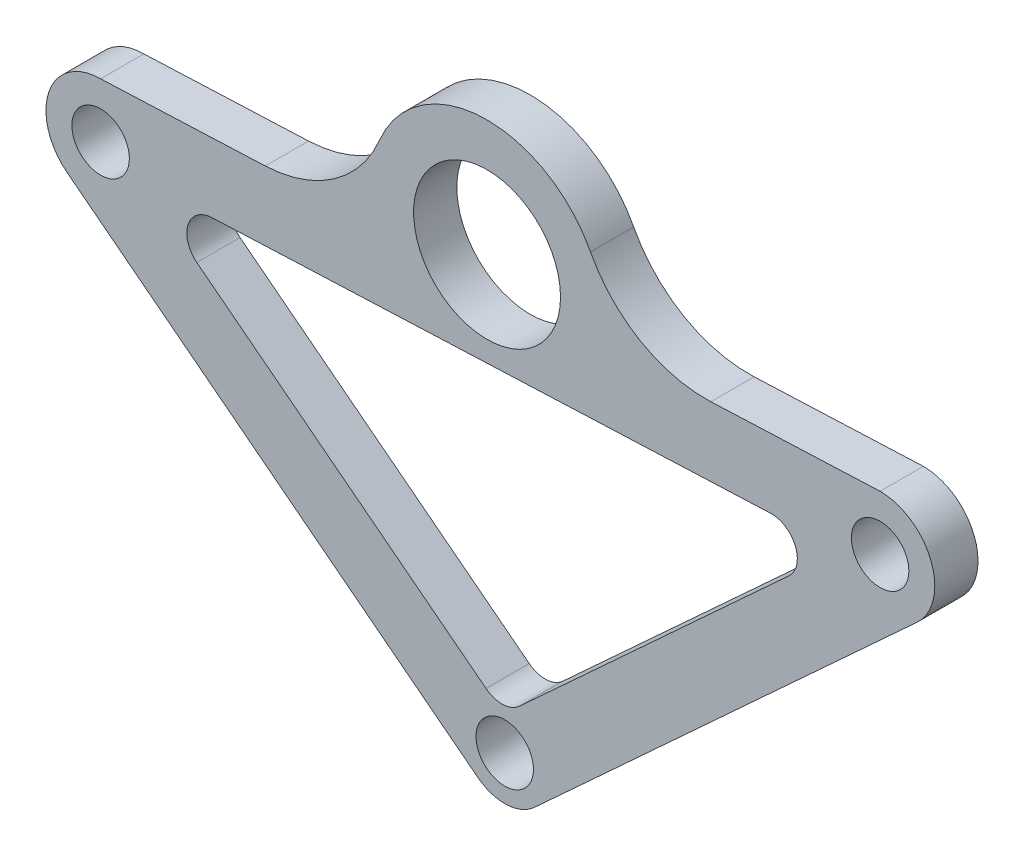
ISO-10303-21;
HEADER;
FILE_DESCRIPTION(('STEP AP214'),'2;1');
FILE_NAME('part.step','',(''),(''),'','','');
FILE_SCHEMA(('AUTOMOTIVE_DESIGN { 1 0 10303 214 1 1 1 1 }'));
ENDSEC;
DATA;
#1=APPLICATION_CONTEXT('core data for automotive mechanical design processes');
#2=APPLICATION_PROTOCOL_DEFINITION('international standard','automotive_design',2000,#1);
#3=PRODUCT_CONTEXT('',#1,'mechanical');
#4=PRODUCT('Part','Part','',(#3));
#5=PRODUCT_RELATED_PRODUCT_CATEGORY('part','',(#4));
#6=PRODUCT_DEFINITION_FORMATION('','',#4);
#7=PRODUCT_DEFINITION_CONTEXT('part definition',#1,'design');
#8=PRODUCT_DEFINITION('design','',#6,#7);
#9=PRODUCT_DEFINITION_SHAPE('','',#8);
#10=(LENGTH_UNIT() NAMED_UNIT(*) SI_UNIT(.MILLI.,.METRE.));
#11=(NAMED_UNIT(*) PLANE_ANGLE_UNIT() SI_UNIT($,.RADIAN.));
#12=(NAMED_UNIT(*) SI_UNIT($,.STERADIAN.) SOLID_ANGLE_UNIT());
#13=UNCERTAINTY_MEASURE_WITH_UNIT(LENGTH_MEASURE(1.E-05),#10,'distance_accuracy_value','');
#14=(GEOMETRIC_REPRESENTATION_CONTEXT(3) GLOBAL_UNCERTAINTY_ASSIGNED_CONTEXT((#13)) GLOBAL_UNIT_ASSIGNED_CONTEXT((#10,
#11,#12)) REPRESENTATION_CONTEXT('',''));
#15=CARTESIAN_POINT('',(0.,0.,0.));
#16=DIRECTION('',(0.,0.,1.));
#17=DIRECTION('',(1.,0.,0.));
#18=AXIS2_PLACEMENT_3D('',#15,#16,#17);
#19=CARTESIAN_POINT('',(-8.8542481683794,-11.4164608048564,2.5));
#20=DIRECTION('',(0.612852318232689,0.790197466483422,0.));
#21=DIRECTION('',(-0.790197466483422,0.612852318232689,0.));
#22=AXIS2_PLACEMENT_3D('',#19,#20,#21);
#23=PLANE('',#22);
#24=DIRECTION('',(0.790197466483422,-0.61285231823269,0.));
#25=VECTOR('',#24,1.);
#26=CARTESIAN_POINT('',(-8.8542481683794,-11.4164608048564,-2.5));
#27=LINE('',#26,#25);
#28=CARTESIAN_POINT('',(-21.5253821373528,-1.58912756613958,-2.5));
#29=VERTEX_POINT('',#28);
#30=CARTESIAN_POINT('',(11.9313136502869,-27.5370892384402,-2.5));
#31=VERTEX_POINT('',#30);
#32=EDGE_CURVE('E226',#29,#31,#27,.T.);
#33=ORIENTED_EDGE('',*,*,#32,.F.);
#34=DIRECTION('',(0.,0.,-1.));
#35=VECTOR('',#34,1.);
#36=CARTESIAN_POINT('',(-21.5253821373528,-1.58912756613958,2.5));
#37=LINE('',#36,#35);
#38=CARTESIAN_POINT('',(-21.5253821373528,-1.58912756613958,2.5));
#39=VERTEX_POINT('',#38);
#40=EDGE_CURVE('E11',#39,#29,#37,.T.);
#41=ORIENTED_EDGE('',*,*,#40,.F.);
#42=DIRECTION('',(0.790197466483422,-0.61285231823269,0.));
#43=VECTOR('',#42,1.);
#44=CARTESIAN_POINT('',(-8.8542481683794,-11.4164608048564,2.5));
#45=LINE('',#44,#43);
#46=CARTESIAN_POINT('',(11.9313136502869,-27.5370892384402,2.5));
#47=VERTEX_POINT('',#46);
#48=EDGE_CURVE('E347',#39,#47,#45,.T.);
#49=ORIENTED_EDGE('',*,*,#48,.T.);
#50=DIRECTION('',(0.,0.,-1.));
#51=VECTOR('',#50,1.);
#52=CARTESIAN_POINT('',(11.9313136502869,-27.5370892384402,2.5));
#53=LINE('',#52,#51);
#54=EDGE_CURVE('E61',#47,#31,#53,.T.);
#55=ORIENTED_EDGE('',*,*,#54,.T.);
#56=EDGE_LOOP('',(#33,#41,#49,#55));
#57=FACE_BOUND('',#56,.T.);
#58=ADVANCED_FACE('F42',(#57),#23,.T.);
#59=CARTESIAN_POINT('',(-19.6868251826548,0.781464833310679,2.5));
#60=DIRECTION('',(0.,0.,-1.));
#61=DIRECTION('',(-1.,0.,0.));
#62=AXIS2_PLACEMENT_3D('',#59,#60,#61);
#63=CYLINDRICAL_SURFACE('',#62,3.);
#64=CARTESIAN_POINT('',(-19.6868251826548,0.781464833310679,-2.5));
#65=DIRECTION('',(0.,0.,1.));
#66=DIRECTION('',(1.,0.,0.));
#67=AXIS2_PLACEMENT_3D('',#64,#65,#66);
#68=CIRCLE('',#67,3.);
#69=CARTESIAN_POINT('',(-19.8120511604004,3.77885010292446,-2.5));
#70=VERTEX_POINT('',#69);
#71=EDGE_CURVE('E228',#29,#70,#68,.F.);
#72=ORIENTED_EDGE('',*,*,#71,.T.);
#73=DIRECTION('',(0.,0.,-1.));
#74=VECTOR('',#73,1.);
#75=CARTESIAN_POINT('',(-19.8120511604004,3.77885010292446,2.5));
#76=LINE('',#75,#74);
#77=CARTESIAN_POINT('',(-19.8120511604004,3.77885010292446,2.5));
#78=VERTEX_POINT('',#77);
#79=EDGE_CURVE('E52',#78,#70,#76,.T.);
#80=ORIENTED_EDGE('',*,*,#79,.F.);
#81=CARTESIAN_POINT('',(-19.6868251826548,0.781464833310679,2.5));
#82=DIRECTION('',(0.,0.,1.));
#83=DIRECTION('',(1.,0.,0.));
#84=AXIS2_PLACEMENT_3D('',#81,#82,#83);
#85=CIRCLE('',#84,3.);
#86=EDGE_CURVE('E349',#39,#78,#85,.F.);
#87=ORIENTED_EDGE('',*,*,#86,.F.);
#88=ORIENTED_EDGE('',*,*,#40,.T.);
#89=EDGE_LOOP('',(#72,#80,#87,#88));
#90=FACE_BOUND('',#89,.T.);
#91=ADVANCED_FACE('F369',(#90),#63,.F.);
#92=CARTESIAN_POINT('',(-0.19211965126212,4.59853956074665,2.5));
#93=DIRECTION('',(0.0417419925818735,-0.999128423204592,0.));
#94=DIRECTION('',(0.999128423204592,0.0417419925818735,0.));
#95=AXIS2_PLACEMENT_3D('',#92,#93,#94);
#96=PLANE('',#95);
#97=DIRECTION('',(-0.999128423204592,-0.0417419925818735,0.));
#98=VECTOR('',#97,1.);
#99=CARTESIAN_POINT('',(-0.19211965126212,4.59853956074665,-2.5));
#100=LINE('',#99,#98);
#101=CARTESIAN_POINT('',(44.820399723161,6.47909085543628,-2.5));
#102=VERTEX_POINT('',#101);
#103=EDGE_CURVE('E231',#102,#70,#100,.T.);
#104=ORIENTED_EDGE('',*,*,#103,.F.);
#105=DIRECTION('',(0.,0.,-1.));
#106=VECTOR('',#105,1.);
#107=CARTESIAN_POINT('',(44.820399723161,6.47909085543628,2.5));
#108=LINE('',#107,#106);
#109=CARTESIAN_POINT('',(44.820399723161,6.47909085543628,2.5));
#110=VERTEX_POINT('',#109);
#111=EDGE_CURVE('E171',#110,#102,#108,.T.);
#112=ORIENTED_EDGE('',*,*,#111,.F.);
#113=DIRECTION('',(-0.999128423204592,-0.0417419925818735,0.));
#114=VECTOR('',#113,1.);
#115=CARTESIAN_POINT('',(-0.19211965126212,4.59853956074665,2.5));
#116=LINE('',#115,#114);
#117=EDGE_CURVE('E181',#110,#78,#116,.T.);
#118=ORIENTED_EDGE('',*,*,#117,.T.);
#119=ORIENTED_EDGE('',*,*,#79,.T.);
#120=EDGE_LOOP('',(#104,#112,#118,#119));
#121=FACE_BOUND('',#120,.T.);
#122=ADVANCED_FACE('F352',(#121),#96,.T.);
#123=CARTESIAN_POINT('',(44.9456257009067,3.4817055858225,2.5));
#124=DIRECTION('',(0.,0.,-1.));
#125=DIRECTION('',(-1.,0.,0.));
#126=AXIS2_PLACEMENT_3D('',#123,#124,#125);
#127=CYLINDRICAL_SURFACE('',#126,3.);
#128=CARTESIAN_POINT('',(44.9456257009067,3.4817055858225,-2.5));
#129=DIRECTION('',(0.,0.,1.));
#130=DIRECTION('',(1.,0.,0.));
#131=AXIS2_PLACEMENT_3D('',#128,#129,#130);
#132=CIRCLE('',#131,3.);
#133=CARTESIAN_POINT('',(46.9755096845863,1.27273048120931,-2.5));
#134=VERTEX_POINT('',#133);
#135=EDGE_CURVE('E167',#134,#102,#132,.T.);
#136=ORIENTED_EDGE('',*,*,#135,.F.);
#137=DIRECTION('',(0.,0.,-1.));
#138=VECTOR('',#137,1.);
#139=CARTESIAN_POINT('',(46.9755096845863,1.27273048120931,2.5));
#140=LINE('',#139,#138);
#141=CARTESIAN_POINT('',(46.9755096845863,1.27273048120931,2.5));
#142=VERTEX_POINT('',#141);
#143=EDGE_CURVE('E162',#142,#134,#140,.T.);
#144=ORIENTED_EDGE('',*,*,#143,.F.);
#145=CARTESIAN_POINT('',(44.9456257009067,3.4817055858225,2.5));
#146=DIRECTION('',(0.,0.,1.));
#147=DIRECTION('',(1.,0.,0.));
#148=AXIS2_PLACEMENT_3D('',#145,#146,#147);
#149=CIRCLE('',#148,3.);
#150=EDGE_CURVE('E165',#142,#110,#149,.T.);
#151=ORIENTED_EDGE('',*,*,#150,.T.);
#152=ORIENTED_EDGE('',*,*,#111,.T.);
#153=EDGE_LOOP('',(#136,#144,#151,#152));
#154=FACE_BOUND('',#153,.T.);
#155=ADVANCED_FACE('F164',(#154),#127,.F.);
#156=CARTESIAN_POINT('',(20.872486130044,-22.7140085853932,2.5));
#157=DIRECTION('',(-0.676627994559879,0.736325034871066,0.));
#158=DIRECTION('',(-0.736325034871066,-0.676627994559879,0.));
#159=AXIS2_PLACEMENT_3D('',#156,#157,#158);
#160=PLANE('',#159);
#161=DIRECTION('',(0.736325034871066,0.676627994559879,0.));
#162=VECTOR('',#161,1.);
#163=CARTESIAN_POINT('',(20.872486130044,-22.7140085853932,-2.5));
#164=LINE('',#163,#162);
#165=CARTESIAN_POINT('',(15.7997545886646,-27.3754719436031,-2.5));
#166=VERTEX_POINT('',#165);
#167=EDGE_CURVE('E235',#166,#134,#164,.T.);
#168=ORIENTED_EDGE('',*,*,#167,.F.);
#169=DIRECTION('',(0.,0.,-1.));
#170=VECTOR('',#169,1.);
#171=CARTESIAN_POINT('',(15.7997545886646,-27.3754719436031,2.5));
#172=LINE('',#171,#170);
#173=CARTESIAN_POINT('',(15.7997545886646,-27.3754719436031,2.5));
#174=VERTEX_POINT('',#173);
#175=EDGE_CURVE('E110',#174,#166,#172,.T.);
#176=ORIENTED_EDGE('',*,*,#175,.F.);
#177=DIRECTION('',(0.736325034871066,0.676627994559879,0.));
#178=VECTOR('',#177,1.);
#179=CARTESIAN_POINT('',(20.872486130044,-22.7140085853932,2.5));
#180=LINE('',#179,#178);
#181=EDGE_CURVE('E179',#174,#142,#180,.T.);
#182=ORIENTED_EDGE('',*,*,#181,.T.);
#183=ORIENTED_EDGE('',*,*,#143,.T.);
#184=EDGE_LOOP('',(#168,#176,#182,#183));
#185=FACE_BOUND('',#184,.T.);
#186=ADVANCED_FACE('F183',(#185),#160,.T.);
#187=CARTESIAN_POINT('',(37.3163550542018,29.1856475864808,2.5));
#188=DIRECTION('',(0.,0.,-1.));
#189=DIRECTION('',(-1.,0.,0.));
#190=AXIS2_PLACEMENT_3D('',#187,#188,#189);
#191=CYLINDRICAL_SURFACE('',#190,15.);
#192=CARTESIAN_POINT('',(37.3163550542018,29.1856475864808,-2.5));
#193=DIRECTION('',(0.,0.,1.));
#194=DIRECTION('',(1.,0.,0.));
#195=AXIS2_PLACEMENT_3D('',#192,#193,#194);
#196=CIRCLE('',#195,15.);
#197=CARTESIAN_POINT('',(24.0182734467296,22.2458330672727,-2.5));
#198=VERTEX_POINT('',#197);
#199=CARTESIAN_POINT('',(37.9424849429299,14.1987212384119,-2.5));
#200=VERTEX_POINT('',#199);
#201=EDGE_CURVE('E190',#198,#200,#196,.T.);
#202=ORIENTED_EDGE('',*,*,#201,.F.);
#203=DIRECTION('',(0.,0.,-1.));
#204=VECTOR('',#203,1.);
#205=CARTESIAN_POINT('',(24.0182734467296,22.2458330672727,2.5));
#206=LINE('',#205,#204);
#207=CARTESIAN_POINT('',(24.0182734467296,22.2458330672727,2.5));
#208=VERTEX_POINT('',#207);
#209=EDGE_CURVE('E46',#208,#198,#206,.T.);
#210=ORIENTED_EDGE('',*,*,#209,.F.);
#211=CARTESIAN_POINT('',(37.3163550542018,29.1856475864808,2.5));
#212=DIRECTION('',(0.,0.,1.));
#213=DIRECTION('',(1.,0.,0.));
#214=AXIS2_PLACEMENT_3D('',#211,#212,#213);
#215=CIRCLE('',#214,15.);
#216=CARTESIAN_POINT('',(37.9424849429299,14.1987212384119,2.5));
#217=VERTEX_POINT('',#216);
#218=EDGE_CURVE('E240',#208,#217,#215,.T.);
#219=ORIENTED_EDGE('',*,*,#218,.T.);
#220=DIRECTION('',(0.,0.,-1.));
#221=VECTOR('',#220,1.);
#222=CARTESIAN_POINT('',(37.9424849429299,14.1987212384119,2.5));
#223=LINE('',#222,#221);
#224=EDGE_CURVE('E186',#217,#200,#223,.T.);
#225=ORIENTED_EDGE('',*,*,#224,.T.);
#226=EDGE_LOOP('',(#202,#210,#219,#225));
#227=FACE_BOUND('',#226,.T.);
#228=ADVANCED_FACE('F44',(#227),#191,.F.);
#229=CARTESIAN_POINT('',(12.0500000000046,15.9999999999855,2.5));
#230=DIRECTION('',(0.,0.,-1.));
#231=DIRECTION('',(-1.,0.,0.));
#232=AXIS2_PLACEMENT_3D('',#229,#230,#231);
#233=CYLINDRICAL_SURFACE('',#232,13.5000000000001);
#234=CARTESIAN_POINT('',(12.0500000000046,15.9999999999855,-2.5));
#235=DIRECTION('',(0.,0.,1.));
#236=DIRECTION('',(1.,0.,0.));
#237=AXIS2_PLACEMENT_3D('',#234,#235,#236);
#238=CIRCLE('',#237,13.5000000000001);
#239=CARTESIAN_POINT('',(-0.397539123776427,21.2257793449198,-2.5));
#240=VERTEX_POINT('',#239);
#241=EDGE_CURVE('E193',#198,#240,#238,.T.);
#242=ORIENTED_EDGE('',*,*,#241,.T.);
#243=DIRECTION('',(0.,0.,-1.));
#244=VECTOR('',#243,1.);
#245=CARTESIAN_POINT('',(-0.397539123776427,21.2257793449198,2.5));
#246=LINE('',#245,#244);
#247=CARTESIAN_POINT('',(-0.397539123776427,21.2257793449198,2.5));
#248=VERTEX_POINT('',#247);
#249=EDGE_CURVE('E265',#248,#240,#246,.T.);
#250=ORIENTED_EDGE('',*,*,#249,.F.);
#251=CARTESIAN_POINT('',(12.0500000000046,15.9999999999855,2.5));
#252=DIRECTION('',(0.,0.,1.));
#253=DIRECTION('',(1.,0.,0.));
#254=AXIS2_PLACEMENT_3D('',#251,#252,#253);
#255=CIRCLE('',#254,13.5000000000001);
#256=EDGE_CURVE('E273',#208,#248,#255,.T.);
#257=ORIENTED_EDGE('',*,*,#256,.F.);
#258=ORIENTED_EDGE('',*,*,#209,.T.);
#259=EDGE_LOOP('',(#242,#250,#257,#258));
#260=FACE_BOUND('',#259,.T.);
#261=ADVANCED_FACE('F272',(#260),#233,.T.);
#262=CARTESIAN_POINT('',(-14.2281381501997,27.0322008392913,2.5));
#263=DIRECTION('',(0.,0.,-1.));
#264=DIRECTION('',(-1.,0.,0.));
#265=AXIS2_PLACEMENT_3D('',#262,#263,#264);
#266=CYLINDRICAL_SURFACE('',#265,15.);
#267=CARTESIAN_POINT('',(-14.2281381501997,27.0322008392913,-2.5));
#268=DIRECTION('',(0.,0.,1.));
#269=DIRECTION('',(1.,0.,0.));
#270=AXIS2_PLACEMENT_3D('',#267,#268,#269);
#271=CIRCLE('',#270,15.);
#272=CARTESIAN_POINT('',(-13.6020082614716,12.0452744912224,-2.5));
#273=VERTEX_POINT('',#272);
#274=EDGE_CURVE('E196',#273,#240,#271,.T.);
#275=ORIENTED_EDGE('',*,*,#274,.F.);
#276=DIRECTION('',(0.,0.,-1.));
#277=VECTOR('',#276,1.);
#278=CARTESIAN_POINT('',(-13.6020082614716,12.0452744912224,2.5));
#279=LINE('',#278,#277);
#280=CARTESIAN_POINT('',(-13.6020082614716,12.0452744912224,2.5));
#281=VERTEX_POINT('',#280);
#282=EDGE_CURVE('E264',#281,#273,#279,.T.);
#283=ORIENTED_EDGE('',*,*,#282,.F.);
#284=CARTESIAN_POINT('',(-14.2281381501997,27.0322008392913,2.5));
#285=DIRECTION('',(0.,0.,1.));
#286=DIRECTION('',(1.,0.,0.));
#287=AXIS2_PLACEMENT_3D('',#284,#285,#286);
#288=CIRCLE('',#287,15.);
#289=EDGE_CURVE('E321',#281,#248,#288,.T.);
#290=ORIENTED_EDGE('',*,*,#289,.T.);
#291=ORIENTED_EDGE('',*,*,#249,.T.);
#292=EDGE_LOOP('',(#275,#283,#290,#291));
#293=FACE_BOUND('',#292,.T.);
#294=ADVANCED_FACE('F320',(#293),#266,.F.);
#295=CARTESIAN_POINT('',(-0.526055591917078,12.5915669463833,2.5));
#296=DIRECTION('',(0.0417419925818713,-0.999128423204592,0.));
#297=DIRECTION('',(0.999128423204592,0.0417419925818713,0.));
#298=AXIS2_PLACEMENT_3D('',#295,#296,#297);
#299=PLANE('',#298);
#300=DIRECTION('',(-0.999128423204592,-0.0417419925818713,0.));
#301=VECTOR('',#300,1.);
#302=CARTESIAN_POINT('',(-0.526055591917078,12.5915669463833,-2.5));
#303=LINE('',#302,#301);
#304=CARTESIAN_POINT('',(-32.6566394074545,11.2492023812981,-2.5));
#305=VERTEX_POINT('',#304);
#306=EDGE_CURVE('E199',#273,#305,#303,.T.);
#307=ORIENTED_EDGE('',*,*,#306,.T.);
#308=DIRECTION('',(0.,0.,-1.));
#309=VECTOR('',#308,1.);
#310=CARTESIAN_POINT('',(-32.6566394074545,11.2492023812981,2.5));
#311=LINE('',#310,#309);
#312=CARTESIAN_POINT('',(-32.6566394074545,11.2492023812981,2.5));
#313=VERTEX_POINT('',#312);
#314=EDGE_CURVE('E261',#313,#305,#311,.T.);
#315=ORIENTED_EDGE('',*,*,#314,.F.);
#316=DIRECTION('',(-0.999128423204592,-0.0417419925818713,0.));
#317=VECTOR('',#316,1.);
#318=CARTESIAN_POINT('',(-0.526055591917078,12.5915669463833,2.5));
#319=LINE('',#318,#317);
#320=EDGE_CURVE('E318',#281,#313,#319,.T.);
#321=ORIENTED_EDGE('',*,*,#320,.F.);
#322=ORIENTED_EDGE('',*,*,#282,.T.);
#323=EDGE_LOOP('',(#307,#315,#321,#322));
#324=FACE_BOUND('',#323,.T.);
#325=ADVANCED_FACE('F317',(#324),#299,.F.);
#326=CARTESIAN_POINT('',(-32.6566394074544,4.92420238127972,2.5));
#327=DIRECTION('',(0.,0.,-1.));
#328=DIRECTION('',(-1.,0.,0.));
#329=AXIS2_PLACEMENT_3D('',#326,#327,#328);
#330=CYLINDRICAL_SURFACE('',#329,6.32500000000671);
#331=CARTESIAN_POINT('',(-32.6566394074544,4.92420238127972,-2.5));
#332=DIRECTION('',(0.,0.,1.));
#333=DIRECTION('',(1.,0.,0.));
#334=AXIS2_PLACEMENT_3D('',#331,#332,#333);
#335=CIRCLE('',#334,6.32500000000671);
#336=CARTESIAN_POINT('',(-36.5329303202918,-0.0737965942095922,-2.5));
#337=VERTEX_POINT('',#336);
#338=EDGE_CURVE('E201',#305,#337,#335,.T.);
#339=ORIENTED_EDGE('',*,*,#338,.T.);
#340=DIRECTION('',(0.,0.,-1.));
#341=VECTOR('',#340,1.);
#342=CARTESIAN_POINT('',(-36.5329303202918,-0.0737965942095922,2.5));
#343=LINE('',#342,#341);
#344=CARTESIAN_POINT('',(-36.5329303202918,-0.0737965942095922,2.5));
#345=VERTEX_POINT('',#344);
#346=EDGE_CURVE('E258',#345,#337,#343,.T.);
#347=ORIENTED_EDGE('',*,*,#346,.F.);
#348=CARTESIAN_POINT('',(-32.6566394074544,4.92420238127972,2.5));
#349=DIRECTION('',(0.,0.,1.));
#350=DIRECTION('',(1.,0.,0.));
#351=AXIS2_PLACEMENT_3D('',#348,#349,#350);
#352=CIRCLE('',#351,6.32500000000671);
#353=EDGE_CURVE('E313',#313,#345,#352,.T.);
#354=ORIENTED_EDGE('',*,*,#353,.F.);
#355=ORIENTED_EDGE('',*,*,#314,.T.);
#356=EDGE_LOOP('',(#339,#347,#354,#355));
#357=FACE_BOUND('',#356,.T.);
#358=ADVANCED_FACE('F312',(#357),#330,.T.);
#359=CARTESIAN_POINT('',(-13.7570667142409,-17.7380405367238,2.5));
#360=DIRECTION('',(0.612852318232689,0.790197466483422,0.));
#361=DIRECTION('',(-0.790197466483422,0.612852318232689,0.));
#362=AXIS2_PLACEMENT_3D('',#359,#360,#361);
#363=PLANE('',#362);
#364=DIRECTION('',(0.790197466483422,-0.612852318232689,0.));
#365=VECTOR('',#364,1.);
#366=CARTESIAN_POINT('',(-13.7570667142409,-17.7380405367238,-2.5));
#367=LINE('',#366,#365);
#368=CARTESIAN_POINT('',(10.9800575124747,-36.923376572056,-2.5));
#369=VERTEX_POINT('',#368);
#370=EDGE_CURVE('E203',#337,#369,#367,.T.);
#371=ORIENTED_EDGE('',*,*,#370,.T.);
#372=DIRECTION('',(0.,0.,-1.));
#373=VECTOR('',#372,1.);
#374=CARTESIAN_POINT('',(10.9800575124747,-36.923376572056,2.5));
#375=LINE('',#374,#373);
#376=CARTESIAN_POINT('',(10.9800575124747,-36.923376572056,2.5));
#377=VERTEX_POINT('',#376);
#378=EDGE_CURVE('E255',#377,#369,#375,.T.);
#379=ORIENTED_EDGE('',*,*,#378,.F.);
#380=DIRECTION('',(0.790197466483422,-0.612852318232689,0.));
#381=VECTOR('',#380,1.);
#382=CARTESIAN_POINT('',(-13.7570667142409,-17.7380405367238,2.5));
#383=LINE('',#382,#381);
#384=EDGE_CURVE('E309',#345,#377,#383,.T.);
#385=ORIENTED_EDGE('',*,*,#384,.F.);
#386=ORIENTED_EDGE('',*,*,#346,.T.);
#387=EDGE_LOOP('',(#371,#379,#385,#386));
#388=FACE_BOUND('',#387,.T.);
#389=ADVANCED_FACE('F306',(#388),#363,.F.);
#390=CARTESIAN_POINT('',(14.0933472890967,-32.9091734423203,2.5));
#391=DIRECTION('',(0.,0.,-1.));
#392=DIRECTION('',(-1.,0.,0.));
#393=AXIS2_PLACEMENT_3D('',#390,#391,#392);
#394=CYLINDRICAL_SURFACE('',#393,5.08000000000001);
#395=CARTESIAN_POINT('',(14.0933472890967,-32.9091734423203,-2.5));
#396=DIRECTION('',(0.,0.,1.));
#397=DIRECTION('',(1.,0.,0.));
#398=AXIS2_PLACEMENT_3D('',#395,#396,#397);
#399=CIRCLE('',#398,5.08000000000001);
#400=CARTESIAN_POINT('',(17.5306175014609,-36.6497046194653,-2.5));
#401=VERTEX_POINT('',#400);
#402=EDGE_CURVE('E205',#369,#401,#399,.T.);
#403=ORIENTED_EDGE('',*,*,#402,.T.);
#404=DIRECTION('',(0.,0.,-1.));
#405=VECTOR('',#404,1.);
#406=CARTESIAN_POINT('',(17.5306175014609,-36.6497046194653,2.5));
#407=LINE('',#406,#405);
#408=CARTESIAN_POINT('',(17.5306175014609,-36.6497046194653,2.5));
#409=VERTEX_POINT('',#408);
#410=EDGE_CURVE('E252',#409,#401,#407,.T.);
#411=ORIENTED_EDGE('',*,*,#410,.F.);
#412=CARTESIAN_POINT('',(14.0933472890967,-32.9091734423203,2.5));
#413=DIRECTION('',(0.,0.,1.));
#414=DIRECTION('',(1.,0.,0.));
#415=AXIS2_PLACEMENT_3D('',#412,#413,#414);
#416=CIRCLE('',#415,5.08000000000001);
#417=EDGE_CURVE('E301',#377,#409,#416,.T.);
#418=ORIENTED_EDGE('',*,*,#417,.F.);
#419=ORIENTED_EDGE('',*,*,#378,.T.);
#420=EDGE_LOOP('',(#403,#411,#418,#419));
#421=FACE_BOUND('',#420,.T.);
#422=ADVANCED_FACE('F300',(#421),#394,.T.);
#423=CARTESIAN_POINT('',(26.285510086523,-28.6046088643617,2.5));
#424=DIRECTION('',(-0.676627994559879,0.736325034871066,0.));
#425=DIRECTION('',(-0.736325034871066,-0.676627994559879,0.));
#426=AXIS2_PLACEMENT_3D('',#423,#424,#425);
#427=PLANE('',#426);
#428=DIRECTION('',(0.736325034871066,0.676627994559879,0.));
#429=VECTOR('',#428,1.);
#430=CARTESIAN_POINT('',(26.285510086523,-28.6046088643617,-2.5));
#431=LINE('',#430,#429);
#432=CARTESIAN_POINT('',(61.8043641365677,4.0345787861778,-2.5));
#433=VERTEX_POINT('',#432);
#434=EDGE_CURVE('E207',#401,#433,#431,.T.);
#435=ORIENTED_EDGE('',*,*,#434,.T.);
#436=DIRECTION('',(0.,0.,-1.));
#437=VECTOR('',#436,1.);
#438=CARTESIAN_POINT('',(61.8043641365677,4.0345787861778,2.5));
#439=LINE('',#438,#437);
#440=CARTESIAN_POINT('',(61.8043641365677,4.0345787861778,2.5));
#441=VERTEX_POINT('',#440);
#442=EDGE_CURVE('E249',#441,#433,#439,.T.);
#443=ORIENTED_EDGE('',*,*,#442,.F.);
#444=DIRECTION('',(0.736325034871066,0.676627994559879,0.));
#445=VECTOR('',#444,1.);
#446=CARTESIAN_POINT('',(26.285510086523,-28.6046088643617,2.5));
#447=LINE('',#446,#445);
#448=EDGE_CURVE('E296',#409,#441,#447,.T.);
#449=ORIENTED_EDGE('',*,*,#448,.F.);
#450=ORIENTED_EDGE('',*,*,#410,.T.);
#451=EDGE_LOOP('',(#435,#443,#449,#450));
#452=FACE_BOUND('',#451,.T.);
#453=ADVANCED_FACE('F295',(#452),#427,.F.);
#454=CARTESIAN_POINT('',(57.5246920709766,8.69183463173721,2.5));
#455=DIRECTION('',(0.,0.,-1.));
#456=DIRECTION('',(-1.,0.,0.));
#457=AXIS2_PLACEMENT_3D('',#454,#455,#456);
#458=CYLINDRICAL_SURFACE('',#457,6.3249999999999);
#459=CARTESIAN_POINT('',(57.5246920709766,8.69183463173721,-2.5));
#460=DIRECTION('',(0.,0.,1.));
#461=DIRECTION('',(1.,0.,0.));
#462=AXIS2_PLACEMENT_3D('',#459,#460,#461);
#463=CIRCLE('',#462,6.3249999999999);
#464=CARTESIAN_POINT('',(57.5246920709766,15.0168346317371,-2.5));
#465=VERTEX_POINT('',#464);
#466=EDGE_CURVE('E209',#433,#465,#463,.T.);
#467=ORIENTED_EDGE('',*,*,#466,.T.);
#468=DIRECTION('',(0.,0.,-1.));
#469=VECTOR('',#468,1.);
#470=CARTESIAN_POINT('',(57.5246920709766,15.0168346317371,2.5));
#471=LINE('',#470,#469);
#472=CARTESIAN_POINT('',(57.5246920709766,15.0168346317371,2.5));
#473=VERTEX_POINT('',#472);
#474=EDGE_CURVE('E246',#473,#465,#471,.T.);
#475=ORIENTED_EDGE('',*,*,#474,.F.);
#476=CARTESIAN_POINT('',(57.5246920709766,8.69183463173721,2.5));
#477=DIRECTION('',(0.,0.,1.));
#478=DIRECTION('',(1.,0.,0.));
#479=AXIS2_PLACEMENT_3D('',#476,#477,#478);
#480=CIRCLE('',#479,6.3249999999999);
#481=EDGE_CURVE('E292',#441,#473,#480,.T.);
#482=ORIENTED_EDGE('',*,*,#481,.F.);
#483=ORIENTED_EDGE('',*,*,#442,.T.);
#484=EDGE_LOOP('',(#467,#475,#482,#483));
#485=FACE_BOUND('',#484,.T.);
#486=ADVANCED_FACE('F289',(#485),#458,.T.);
#487=CARTESIAN_POINT('',(-32.6566394074544,4.92420238127972,2.5));
#488=DIRECTION('',(0.,0.,-1.));
#489=DIRECTION('',(-1.,0.,0.));
#490=AXIS2_PLACEMENT_3D('',#487,#488,#489);
#491=CYLINDRICAL_SURFACE('',#490,3.32499999999999);
#492=CARTESIAN_POINT('',(-32.6566394074544,4.92420238127972,2.5));
#493=DIRECTION('',(0.,0.,1.));
#494=DIRECTION('',(1.,0.,0.));
#495=AXIS2_PLACEMENT_3D('',#492,#493,#494);
#496=CIRCLE('',#495,3.32499999999999);
#497=CARTESIAN_POINT('',(-29.3316394074545,4.92420238127972,2.5));
#498=VERTEX_POINT('',#497);
#499=EDGE_CURVE('E344',#498,#498,#496,.T.);
#500=ORIENTED_EDGE('',*,*,#499,.T.);
#501=EDGE_LOOP('',(#500));
#502=FACE_BOUND('',#501,.T.);
#503=CARTESIAN_POINT('',(-32.6566394074544,4.92420238127972,-2.5));
#504=DIRECTION('',(0.,0.,1.));
#505=DIRECTION('',(1.,0.,0.));
#506=AXIS2_PLACEMENT_3D('',#503,#504,#505);
#507=CIRCLE('',#506,3.32499999999999);
#508=CARTESIAN_POINT('',(-29.3316394074545,4.92420238127972,-2.5));
#509=VERTEX_POINT('',#508);
#510=EDGE_CURVE('E223',#509,#509,#507,.T.);
#511=ORIENTED_EDGE('',*,*,#510,.F.);
#512=EDGE_LOOP('',(#511));
#513=FACE_BOUND('',#512,.T.);
#514=ADVANCED_FACE('F378',(#502,#513),#491,.F.);
#515=CARTESIAN_POINT('',(14.0933472890967,-32.9091734423203,2.5));
#516=DIRECTION('',(0.,0.,-1.));
#517=DIRECTION('',(-1.,0.,0.));
#518=AXIS2_PLACEMENT_3D('',#515,#516,#517);
#519=CYLINDRICAL_SURFACE('',#518,3.325);
#520=CARTESIAN_POINT('',(14.0933472890967,-32.9091734423203,2.5));
#521=DIRECTION('',(0.,0.,1.));
#522=DIRECTION('',(1.,0.,0.));
#523=AXIS2_PLACEMENT_3D('',#520,#521,#522);
#524=CIRCLE('',#523,3.325);
#525=CARTESIAN_POINT('',(17.4183472890967,-32.9091734423203,2.5));
#526=VERTEX_POINT('',#525);
#527=EDGE_CURVE('E341',#526,#526,#524,.T.);
#528=ORIENTED_EDGE('',*,*,#527,.T.);
#529=EDGE_LOOP('',(#528));
#530=FACE_BOUND('',#529,.T.);
#531=CARTESIAN_POINT('',(14.0933472890967,-32.9091734423203,-2.5));
#532=DIRECTION('',(0.,0.,1.));
#533=DIRECTION('',(1.,0.,0.));
#534=AXIS2_PLACEMENT_3D('',#531,#532,#533);
#535=CIRCLE('',#534,3.325);
#536=CARTESIAN_POINT('',(17.4183472890967,-32.9091734423203,-2.5));
#537=VERTEX_POINT('',#536);
#538=EDGE_CURVE('E220',#537,#537,#535,.T.);
#539=ORIENTED_EDGE('',*,*,#538,.F.);
#540=EDGE_LOOP('',(#539));
#541=FACE_BOUND('',#540,.T.);
#542=ADVANCED_FACE('F381',(#530,#541),#519,.F.);
#543=CARTESIAN_POINT('',(57.5246920709766,8.69183463173721,2.5));
#544=DIRECTION('',(0.,0.,-1.));
#545=DIRECTION('',(-1.,0.,0.));
#546=AXIS2_PLACEMENT_3D('',#543,#544,#545);
#547=CYLINDRICAL_SURFACE('',#546,3.325);
#548=CARTESIAN_POINT('',(57.5246920709766,8.69183463173721,2.5));
#549=DIRECTION('',(0.,0.,1.));
#550=DIRECTION('',(1.,0.,0.));
#551=AXIS2_PLACEMENT_3D('',#548,#549,#550);
#552=CIRCLE('',#551,3.325);
#553=CARTESIAN_POINT('',(60.8496920709766,8.69183463173721,2.5));
#554=VERTEX_POINT('',#553);
#555=EDGE_CURVE('E338',#554,#554,#552,.T.);
#556=ORIENTED_EDGE('',*,*,#555,.T.);
#557=EDGE_LOOP('',(#556));
#558=FACE_BOUND('',#557,.T.);
#559=CARTESIAN_POINT('',(57.5246920709766,8.69183463173721,-2.5));
#560=DIRECTION('',(0.,0.,1.));
#561=DIRECTION('',(1.,0.,0.));
#562=AXIS2_PLACEMENT_3D('',#559,#560,#561);
#563=CIRCLE('',#562,3.325);
#564=CARTESIAN_POINT('',(60.8496920709766,8.69183463173721,-2.5));
#565=VERTEX_POINT('',#564);
#566=EDGE_CURVE('E217',#565,#565,#563,.T.);
#567=ORIENTED_EDGE('',*,*,#566,.F.);
#568=EDGE_LOOP('',(#567));
#569=FACE_BOUND('',#568,.T.);
#570=ADVANCED_FACE('F385',(#558,#569),#547,.F.);
#571=CARTESIAN_POINT('',(12.0500000000046,15.9999999999855,2.5));
#572=DIRECTION('',(0.,0.,-1.));
#573=DIRECTION('',(-1.,0.,0.));
#574=AXIS2_PLACEMENT_3D('',#571,#572,#573);
#575=CYLINDRICAL_SURFACE('',#574,8.50000000000009);
#576=CARTESIAN_POINT('',(12.0500000000046,15.9999999999855,2.5));
#577=DIRECTION('',(0.,0.,1.));
#578=DIRECTION('',(1.,0.,0.));
#579=AXIS2_PLACEMENT_3D('',#576,#577,#578);
#580=CIRCLE('',#579,8.50000000000009);
#581=CARTESIAN_POINT('',(20.5500000000047,15.9999999999855,2.5));
#582=VERTEX_POINT('',#581);
#583=EDGE_CURVE('E335',#582,#582,#580,.T.);
#584=ORIENTED_EDGE('',*,*,#583,.T.);
#585=EDGE_LOOP('',(#584));
#586=FACE_BOUND('',#585,.T.);
#587=CARTESIAN_POINT('',(12.0500000000046,15.9999999999855,-2.5));
#588=DIRECTION('',(0.,0.,1.));
#589=DIRECTION('',(1.,0.,0.));
#590=AXIS2_PLACEMENT_3D('',#587,#588,#589);
#591=CIRCLE('',#590,8.50000000000009);
#592=CARTESIAN_POINT('',(20.5500000000047,15.9999999999855,-2.5));
#593=VERTEX_POINT('',#592);
#594=EDGE_CURVE('E214',#593,#593,#591,.T.);
#595=ORIENTED_EDGE('',*,*,#594,.F.);
#596=EDGE_LOOP('',(#595));
#597=FACE_BOUND('',#596,.T.);
#598=ADVANCED_FACE('F364',(#586,#597),#575,.F.);
#599=CARTESIAN_POINT('',(-0.526055591917079,12.5915669463833,2.5));
#600=DIRECTION('',(0.0417419925818714,-0.999128423204592,0.));
#601=DIRECTION('',(0.999128423204592,0.0417419925818714,0.));
#602=AXIS2_PLACEMENT_3D('',#599,#600,#601);
#603=PLANE('',#602);
#604=DIRECTION('',(-0.999128423204592,-0.0417419925818714,0.));
#605=VECTOR('',#604,1.);
#606=CARTESIAN_POINT('',(-0.526055591917079,12.5915669463833,-2.5));
#607=LINE('',#606,#605);
#608=EDGE_CURVE('E211',#465,#200,#607,.T.);
#609=ORIENTED_EDGE('',*,*,#608,.T.);
#610=ORIENTED_EDGE('',*,*,#224,.F.);
#611=DIRECTION('',(-0.999128423204592,-0.0417419925818714,0.));
#612=VECTOR('',#611,1.);
#613=CARTESIAN_POINT('',(-0.526055591917079,12.5915669463833,2.5));
#614=LINE('',#613,#612);
#615=EDGE_CURVE('E333',#473,#217,#614,.T.);
#616=ORIENTED_EDGE('',*,*,#615,.F.);
#617=ORIENTED_EDGE('',*,*,#474,.T.);
#618=EDGE_LOOP('',(#609,#610,#616,#617));
#619=FACE_BOUND('',#618,.T.);
#620=ADVANCED_FACE('F283',(#619),#603,.F.);
#621=CARTESIAN_POINT('',(13.769870604985,-25.1664968389899,2.5));
#622=DIRECTION('',(0.,0.,-1.));
#623=DIRECTION('',(-1.,0.,0.));
#624=AXIS2_PLACEMENT_3D('',#621,#622,#623);
#625=CYLINDRICAL_SURFACE('',#624,3.);
#626=CARTESIAN_POINT('',(13.769870604985,-25.1664968389899,-2.5));
#627=DIRECTION('',(0.,0.,1.));
#628=DIRECTION('',(1.,0.,0.));
#629=AXIS2_PLACEMENT_3D('',#626,#627,#628);
#630=CIRCLE('',#629,3.);
#631=EDGE_CURVE('E237',#31,#166,#630,.T.);
#632=ORIENTED_EDGE('',*,*,#631,.F.);
#633=ORIENTED_EDGE('',*,*,#54,.F.);
#634=CARTESIAN_POINT('',(13.769870604985,-25.1664968389899,2.5));
#635=DIRECTION('',(0.,0.,1.));
#636=DIRECTION('',(1.,0.,0.));
#637=AXIS2_PLACEMENT_3D('',#634,#635,#636);
#638=CIRCLE('',#637,3.);
#639=EDGE_CURVE('E184',#47,#174,#638,.T.);
#640=ORIENTED_EDGE('',*,*,#639,.T.);
#641=ORIENTED_EDGE('',*,*,#175,.T.);
#642=EDGE_LOOP('',(#632,#633,#640,#641));
#643=FACE_BOUND('',#642,.T.);
#644=ADVANCED_FACE('F356',(#643),#625,.F.);
#645=CARTESIAN_POINT('',(0.,0.,2.5));
#646=DIRECTION('',(0.,0.,1.));
#647=DIRECTION('',(1.,0.,0.));
#648=AXIS2_PLACEMENT_3D('',#645,#646,#647);
#649=PLANE('',#648);
#650=ORIENTED_EDGE('',*,*,#218,.F.);
#651=ORIENTED_EDGE('',*,*,#256,.T.);
#652=ORIENTED_EDGE('',*,*,#289,.F.);
#653=ORIENTED_EDGE('',*,*,#320,.T.);
#654=ORIENTED_EDGE('',*,*,#353,.T.);
#655=ORIENTED_EDGE('',*,*,#384,.T.);
#656=ORIENTED_EDGE('',*,*,#417,.T.);
#657=ORIENTED_EDGE('',*,*,#448,.T.);
#658=ORIENTED_EDGE('',*,*,#481,.T.);
#659=ORIENTED_EDGE('',*,*,#615,.T.);
#660=EDGE_LOOP('',(#650,#651,#652,#653,#654,#655,#656,#657,#658,#659));
#661=FACE_BOUND('',#660,.T.);
#662=ORIENTED_EDGE('',*,*,#583,.F.);
#663=EDGE_LOOP('',(#662));
#664=FACE_BOUND('',#663,.T.);
#665=ORIENTED_EDGE('',*,*,#555,.F.);
#666=EDGE_LOOP('',(#665));
#667=FACE_BOUND('',#666,.T.);
#668=ORIENTED_EDGE('',*,*,#527,.F.);
#669=EDGE_LOOP('',(#668));
#670=FACE_BOUND('',#669,.T.);
#671=ORIENTED_EDGE('',*,*,#499,.F.);
#672=EDGE_LOOP('',(#671));
#673=FACE_BOUND('',#672,.T.);
#674=ORIENTED_EDGE('',*,*,#48,.F.);
#675=ORIENTED_EDGE('',*,*,#86,.T.);
#676=ORIENTED_EDGE('',*,*,#117,.F.);
#677=ORIENTED_EDGE('',*,*,#150,.F.);
#678=ORIENTED_EDGE('',*,*,#181,.F.);
#679=ORIENTED_EDGE('',*,*,#639,.F.);
#680=EDGE_LOOP('',(#674,#675,#676,#677,#678,#679));
#681=FACE_BOUND('',#680,.T.);
#682=ADVANCED_FACE('F177',(#661,#664,#667,#670,#673,#681),#649,.T.);
#683=CARTESIAN_POINT('',(0.,0.,-2.5));
#684=DIRECTION('',(0.,0.,1.));
#685=DIRECTION('',(1.,0.,0.));
#686=AXIS2_PLACEMENT_3D('',#683,#684,#685);
#687=PLANE('',#686);
#688=ORIENTED_EDGE('',*,*,#201,.T.);
#689=ORIENTED_EDGE('',*,*,#608,.F.);
#690=ORIENTED_EDGE('',*,*,#466,.F.);
#691=ORIENTED_EDGE('',*,*,#434,.F.);
#692=ORIENTED_EDGE('',*,*,#402,.F.);
#693=ORIENTED_EDGE('',*,*,#370,.F.);
#694=ORIENTED_EDGE('',*,*,#338,.F.);
#695=ORIENTED_EDGE('',*,*,#306,.F.);
#696=ORIENTED_EDGE('',*,*,#274,.T.);
#697=ORIENTED_EDGE('',*,*,#241,.F.);
#698=EDGE_LOOP('',(#688,#689,#690,#691,#692,#693,#694,#695,#696,#697));
#699=FACE_BOUND('',#698,.T.);
#700=ORIENTED_EDGE('',*,*,#594,.T.);
#701=EDGE_LOOP('',(#700));
#702=FACE_BOUND('',#701,.T.);
#703=ORIENTED_EDGE('',*,*,#566,.T.);
#704=EDGE_LOOP('',(#703));
#705=FACE_BOUND('',#704,.T.);
#706=ORIENTED_EDGE('',*,*,#538,.T.);
#707=EDGE_LOOP('',(#706));
#708=FACE_BOUND('',#707,.T.);
#709=ORIENTED_EDGE('',*,*,#510,.T.);
#710=EDGE_LOOP('',(#709));
#711=FACE_BOUND('',#710,.T.);
#712=ORIENTED_EDGE('',*,*,#32,.T.);
#713=ORIENTED_EDGE('',*,*,#631,.T.);
#714=ORIENTED_EDGE('',*,*,#167,.T.);
#715=ORIENTED_EDGE('',*,*,#135,.T.);
#716=ORIENTED_EDGE('',*,*,#103,.T.);
#717=ORIENTED_EDGE('',*,*,#71,.F.);
#718=EDGE_LOOP('',(#712,#713,#714,#715,#716,#717));
#719=FACE_BOUND('',#718,.T.);
#720=ADVANCED_FACE('F276',(#699,#702,#705,#708,#711,#719),#687,.F.);
#721=CLOSED_SHELL('',(#58,#91,#122,#155,#186,#228,#261,#294,#325,#358,#389,#422,#453,#486,#514,
#542,#570,#598,#620,#644,#682,#720));
#722=MANIFOLD_SOLID_BREP('B2',#721);
#723=ADVANCED_BREP_SHAPE_REPRESENTATION('',(#18,#722),#14);
#724=SHAPE_DEFINITION_REPRESENTATION(#9,#723);
ENDSEC;
END-ISO-10303-21;
